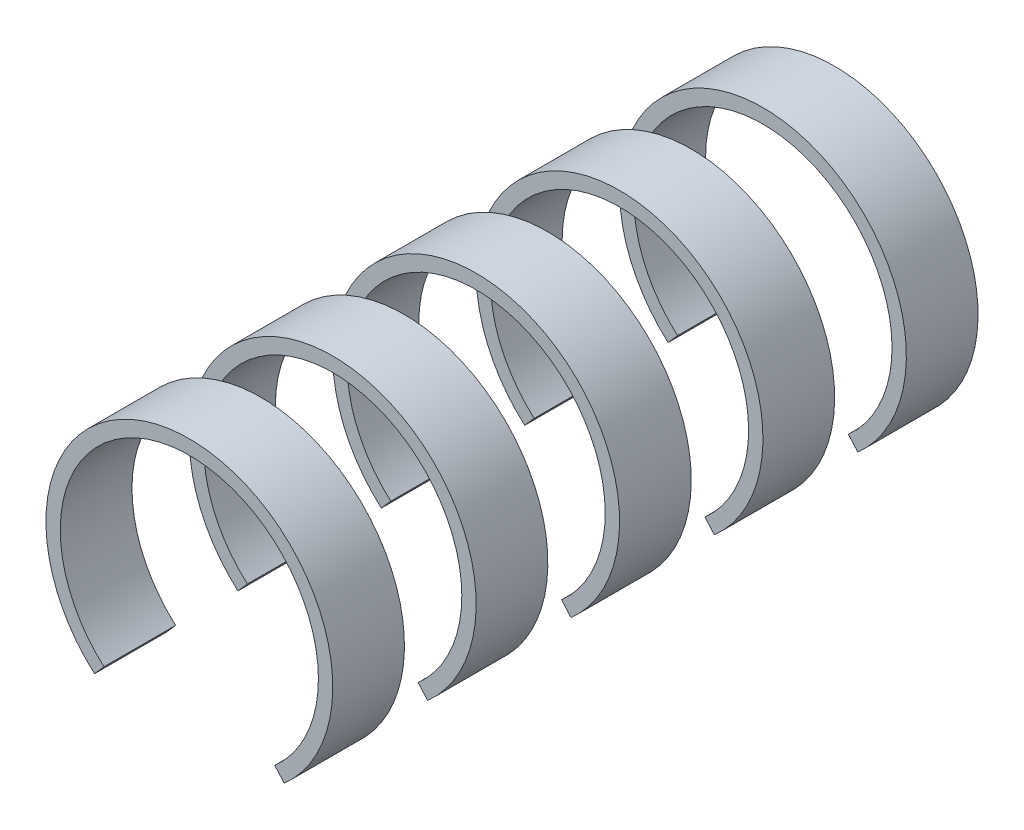
ISO-10303-21;
HEADER;
FILE_DESCRIPTION(('STEP AP214'),'2;1');
FILE_NAME('part.step','',(''),(''),'','','');
FILE_SCHEMA(('AUTOMOTIVE_DESIGN { 1 0 10303 214 1 1 1 1 }'));
ENDSEC;
DATA;
#1=APPLICATION_CONTEXT('core data for automotive mechanical design processes');
#2=APPLICATION_PROTOCOL_DEFINITION('international standard','automotive_design',2000,#1);
#3=PRODUCT_CONTEXT('',#1,'mechanical');
#4=PRODUCT('Part','Part','',(#3));
#5=PRODUCT_RELATED_PRODUCT_CATEGORY('part','',(#4));
#6=PRODUCT_DEFINITION_FORMATION('','',#4);
#7=PRODUCT_DEFINITION_CONTEXT('part definition',#1,'design');
#8=PRODUCT_DEFINITION('design','',#6,#7);
#9=PRODUCT_DEFINITION_SHAPE('','',#8);
#10=(LENGTH_UNIT() NAMED_UNIT(*) SI_UNIT(.MILLI.,.METRE.));
#11=(NAMED_UNIT(*) PLANE_ANGLE_UNIT() SI_UNIT($,.RADIAN.));
#12=(NAMED_UNIT(*) SI_UNIT($,.STERADIAN.) SOLID_ANGLE_UNIT());
#13=UNCERTAINTY_MEASURE_WITH_UNIT(LENGTH_MEASURE(1.E-05),#10,'distance_accuracy_value','');
#14=(GEOMETRIC_REPRESENTATION_CONTEXT(3) GLOBAL_UNCERTAINTY_ASSIGNED_CONTEXT((#13)) GLOBAL_UNIT_ASSIGNED_CONTEXT((#10,
#11,#12)) REPRESENTATION_CONTEXT('',''));
#15=CARTESIAN_POINT('',(0.,0.,0.));
#16=DIRECTION('',(0.,0.,1.));
#17=DIRECTION('',(1.,0.,0.));
#18=AXIS2_PLACEMENT_3D('',#15,#16,#17);
#19=CARTESIAN_POINT('',(0.,78.,-800.));
#20=DIRECTION('',(0.,0.,1.));
#21=DIRECTION('',(1.,0.,0.));
#22=AXIS2_PLACEMENT_3D('',#19,#20,#21);
#23=CYLINDRICAL_SURFACE('',#22,90.);
#24=CARTESIAN_POINT('',(0.,78.,-750.));
#25=DIRECTION('',(0.,0.,1.));
#26=DIRECTION('',(1.,0.,0.));
#27=AXIS2_PLACEMENT_3D('',#24,#25,#26);
#28=CIRCLE('',#27,90.);
#29=CARTESIAN_POINT('',(-59.5294044989533,10.5,-750.));
#30=VERTEX_POINT('',#29);
#31=CARTESIAN_POINT('',(59.5294044989532,10.5,-750.));
#32=VERTEX_POINT('',#31);
#33=EDGE_CURVE('E115',#30,#32,#28,.F.);
#34=ORIENTED_EDGE('',*,*,#33,.F.);
#35=DIRECTION('',(0.,0.,1.));
#36=VECTOR('',#35,1.);
#37=CARTESIAN_POINT('',(-59.5294044989533,10.5,-800.));
#38=LINE('',#37,#36);
#39=CARTESIAN_POINT('',(-59.5294044989533,10.5,-800.));
#40=VERTEX_POINT('',#39);
#41=EDGE_CURVE('E12',#40,#30,#38,.T.);
#42=ORIENTED_EDGE('',*,*,#41,.F.);
#43=CARTESIAN_POINT('',(0.,78.,-800.));
#44=DIRECTION('',(0.,0.,1.));
#45=DIRECTION('',(1.,0.,0.));
#46=AXIS2_PLACEMENT_3D('',#43,#44,#45);
#47=CIRCLE('',#46,90.);
#48=CARTESIAN_POINT('',(59.5294044989532,10.5,-800.));
#49=VERTEX_POINT('',#48);
#50=EDGE_CURVE('E110',#40,#49,#47,.F.);
#51=ORIENTED_EDGE('',*,*,#50,.T.);
#52=DIRECTION('',(0.,0.,1.));
#53=VECTOR('',#52,1.);
#54=CARTESIAN_POINT('',(59.5294044989532,10.5,-800.));
#55=LINE('',#54,#53);
#56=EDGE_CURVE('E53',#49,#32,#55,.T.);
#57=ORIENTED_EDGE('',*,*,#56,.T.);
#58=EDGE_LOOP('',(#34,#42,#51,#57));
#59=FACE_BOUND('',#58,.T.);
#60=ADVANCED_FACE('F50',(#59),#23,.F.);
#61=CARTESIAN_POINT('',(-59.5294044989533,10.5,-800.));
#62=DIRECTION('',(-0.750000000000002,0.661437827766145,0.));
#63=DIRECTION('',(-0.661437827766145,-0.750000000000002,0.));
#64=AXIS2_PLACEMENT_3D('',#61,#62,#63);
#65=PLANE('',#64);
#66=DIRECTION('',(-0.661437827766145,-0.750000000000002,0.));
#67=VECTOR('',#66,1.);
#68=CARTESIAN_POINT('',(-59.5294044989533,10.5,-750.));
#69=LINE('',#68,#67);
#70=CARTESIAN_POINT('',(-66.1437827766148,3.,-750.));
#71=VERTEX_POINT('',#70);
#72=EDGE_CURVE('E83',#30,#71,#69,.T.);
#73=ORIENTED_EDGE('',*,*,#72,.T.);
#74=DIRECTION('',(0.,0.,1.));
#75=VECTOR('',#74,1.);
#76=CARTESIAN_POINT('',(-66.1437827766148,3.,-800.));
#77=LINE('',#76,#75);
#78=CARTESIAN_POINT('',(-66.1437827766148,3.,-800.));
#79=VERTEX_POINT('',#78);
#80=EDGE_CURVE('E59',#79,#71,#77,.T.);
#81=ORIENTED_EDGE('',*,*,#80,.F.);
#82=DIRECTION('',(-0.661437827766145,-0.750000000000002,0.));
#83=VECTOR('',#82,1.);
#84=CARTESIAN_POINT('',(-59.5294044989533,10.5,-800.));
#85=LINE('',#84,#83);
#86=EDGE_CURVE('E98',#40,#79,#85,.T.);
#87=ORIENTED_EDGE('',*,*,#86,.F.);
#88=ORIENTED_EDGE('',*,*,#41,.T.);
#89=EDGE_LOOP('',(#73,#81,#87,#88));
#90=FACE_BOUND('',#89,.T.);
#91=ADVANCED_FACE('F125',(#90),#65,.F.);
#92=CARTESIAN_POINT('',(0.,78.,-800.));
#93=DIRECTION('',(0.,0.,1.));
#94=DIRECTION('',(1.,0.,0.));
#95=AXIS2_PLACEMENT_3D('',#92,#93,#94);
#96=CYLINDRICAL_SURFACE('',#95,100.);
#97=CARTESIAN_POINT('',(0.,78.,-750.));
#98=DIRECTION('',(0.,0.,-1.));
#99=DIRECTION('',(-1.,0.,0.));
#100=AXIS2_PLACEMENT_3D('',#97,#98,#99);
#101=CIRCLE('',#100,100.);
#102=CARTESIAN_POINT('',(66.1437827766147,2.99999999999998,-750.));
#103=VERTEX_POINT('',#102);
#104=EDGE_CURVE('E105',#71,#103,#101,.T.);
#105=ORIENTED_EDGE('',*,*,#104,.T.);
#106=DIRECTION('',(0.,0.,1.));
#107=VECTOR('',#106,1.);
#108=CARTESIAN_POINT('',(66.1437827766147,2.99999999999998,-800.));
#109=LINE('',#108,#107);
#110=CARTESIAN_POINT('',(66.1437827766147,2.99999999999998,-800.));
#111=VERTEX_POINT('',#110);
#112=EDGE_CURVE('E102',#111,#103,#109,.T.);
#113=ORIENTED_EDGE('',*,*,#112,.F.);
#114=CARTESIAN_POINT('',(0.,78.,-800.));
#115=DIRECTION('',(0.,0.,-1.));
#116=DIRECTION('',(-1.,0.,0.));
#117=AXIS2_PLACEMENT_3D('',#114,#115,#116);
#118=CIRCLE('',#117,100.);
#119=EDGE_CURVE('E95',#79,#111,#118,.T.);
#120=ORIENTED_EDGE('',*,*,#119,.F.);
#121=ORIENTED_EDGE('',*,*,#80,.T.);
#122=EDGE_LOOP('',(#105,#113,#120,#121));
#123=FACE_BOUND('',#122,.T.);
#124=ADVANCED_FACE('F103',(#123),#96,.T.);
#125=CARTESIAN_POINT('',(66.1437827766147,2.99999999999998,-800.));
#126=DIRECTION('',(0.749999999999998,0.66143782776615,0.));
#127=DIRECTION('',(-0.66143782776615,0.749999999999998,0.));
#128=AXIS2_PLACEMENT_3D('',#125,#126,#127);
#129=PLANE('',#128);
#130=DIRECTION('',(-0.66143782776615,0.749999999999998,0.));
#131=VECTOR('',#130,1.);
#132=CARTESIAN_POINT('',(66.1437827766147,2.99999999999998,-750.));
#133=LINE('',#132,#131);
#134=EDGE_CURVE('E118',#103,#32,#133,.T.);
#135=ORIENTED_EDGE('',*,*,#134,.T.);
#136=ORIENTED_EDGE('',*,*,#56,.F.);
#137=DIRECTION('',(-0.66143782776615,0.749999999999998,0.));
#138=VECTOR('',#137,1.);
#139=CARTESIAN_POINT('',(66.1437827766147,2.99999999999998,-800.));
#140=LINE('',#139,#138);
#141=EDGE_CURVE('E92',#111,#49,#140,.T.);
#142=ORIENTED_EDGE('',*,*,#141,.F.);
#143=ORIENTED_EDGE('',*,*,#112,.T.);
#144=EDGE_LOOP('',(#135,#136,#142,#143));
#145=FACE_BOUND('',#144,.T.);
#146=ADVANCED_FACE('F109',(#145),#129,.F.);
#147=CARTESIAN_POINT('',(0.,78.,-800.));
#148=DIRECTION('',(0.,0.,1.));
#149=DIRECTION('',(1.,0.,0.));
#150=AXIS2_PLACEMENT_3D('',#147,#148,#149);
#151=PLANE('',#150);
#152=ORIENTED_EDGE('',*,*,#50,.F.);
#153=ORIENTED_EDGE('',*,*,#86,.T.);
#154=ORIENTED_EDGE('',*,*,#119,.T.);
#155=ORIENTED_EDGE('',*,*,#141,.T.);
#156=EDGE_LOOP('',(#152,#153,#154,#155));
#157=FACE_BOUND('',#156,.T.);
#158=ADVANCED_FACE('F97',(#157),#151,.F.);
#159=CARTESIAN_POINT('',(0.,78.,-750.));
#160=DIRECTION('',(0.,0.,1.));
#161=DIRECTION('',(1.,0.,0.));
#162=AXIS2_PLACEMENT_3D('',#159,#160,#161);
#163=PLANE('',#162);
#164=ORIENTED_EDGE('',*,*,#33,.T.);
#165=ORIENTED_EDGE('',*,*,#134,.F.);
#166=ORIENTED_EDGE('',*,*,#104,.F.);
#167=ORIENTED_EDGE('',*,*,#72,.F.);
#168=EDGE_LOOP('',(#164,#165,#166,#167));
#169=FACE_BOUND('',#168,.T.);
#170=ADVANCED_FACE('F123',(#169),#163,.T.);
#171=CLOSED_SHELL('',(#60,#91,#124,#146,#158,#170));
#172=MANIFOLD_SOLID_BREP('B2',#171);
#173=CARTESIAN_POINT('',(0.,78.,-700.));
#174=DIRECTION('',(0.,0.,1.));
#175=DIRECTION('',(1.,0.,0.));
#176=AXIS2_PLACEMENT_3D('',#173,#174,#175);
#177=CYLINDRICAL_SURFACE('',#176,90.);
#178=CARTESIAN_POINT('',(0.,78.,-650.));
#179=DIRECTION('',(0.,0.,1.));
#180=DIRECTION('',(1.,0.,0.));
#181=AXIS2_PLACEMENT_3D('',#178,#179,#180);
#182=CIRCLE('',#181,90.);
#183=CARTESIAN_POINT('',(-59.5294044989533,10.5,-650.));
#184=VERTEX_POINT('',#183);
#185=CARTESIAN_POINT('',(59.5294044989532,10.5,-650.));
#186=VERTEX_POINT('',#185);
#187=EDGE_CURVE('E249',#184,#186,#182,.F.);
#188=ORIENTED_EDGE('',*,*,#187,.F.);
#189=DIRECTION('',(0.,0.,1.));
#190=VECTOR('',#189,1.);
#191=CARTESIAN_POINT('',(-59.5294044989533,10.5,-700.));
#192=LINE('',#191,#190);
#193=CARTESIAN_POINT('',(-59.5294044989533,10.5,-700.));
#194=VERTEX_POINT('',#193);
#195=EDGE_CURVE('E48',#194,#184,#192,.T.);
#196=ORIENTED_EDGE('',*,*,#195,.F.);
#197=CARTESIAN_POINT('',(0.,78.,-700.));
#198=DIRECTION('',(0.,0.,1.));
#199=DIRECTION('',(1.,0.,0.));
#200=AXIS2_PLACEMENT_3D('',#197,#198,#199);
#201=CIRCLE('',#200,90.);
#202=CARTESIAN_POINT('',(59.5294044989532,10.5,-700.));
#203=VERTEX_POINT('',#202);
#204=EDGE_CURVE('E244',#194,#203,#201,.F.);
#205=ORIENTED_EDGE('',*,*,#204,.T.);
#206=DIRECTION('',(0.,0.,1.));
#207=VECTOR('',#206,1.);
#208=CARTESIAN_POINT('',(59.5294044989532,10.5,-700.));
#209=LINE('',#208,#207);
#210=EDGE_CURVE('E187',#203,#186,#209,.T.);
#211=ORIENTED_EDGE('',*,*,#210,.T.);
#212=EDGE_LOOP('',(#188,#196,#205,#211));
#213=FACE_BOUND('',#212,.T.);
#214=ADVANCED_FACE('F184',(#213),#177,.F.);
#215=CARTESIAN_POINT('',(-59.5294044989533,10.5,-700.));
#216=DIRECTION('',(-0.750000000000002,0.661437827766145,0.));
#217=DIRECTION('',(-0.661437827766145,-0.750000000000002,0.));
#218=AXIS2_PLACEMENT_3D('',#215,#216,#217);
#219=PLANE('',#218);
#220=DIRECTION('',(-0.661437827766145,-0.750000000000002,0.));
#221=VECTOR('',#220,1.);
#222=CARTESIAN_POINT('',(-59.5294044989533,10.5,-650.));
#223=LINE('',#222,#221);
#224=CARTESIAN_POINT('',(-66.1437827766148,3.,-650.));
#225=VERTEX_POINT('',#224);
#226=EDGE_CURVE('E217',#184,#225,#223,.T.);
#227=ORIENTED_EDGE('',*,*,#226,.T.);
#228=DIRECTION('',(0.,0.,1.));
#229=VECTOR('',#228,1.);
#230=CARTESIAN_POINT('',(-66.1437827766148,3.,-700.));
#231=LINE('',#230,#229);
#232=CARTESIAN_POINT('',(-66.1437827766148,3.,-700.));
#233=VERTEX_POINT('',#232);
#234=EDGE_CURVE('E193',#233,#225,#231,.T.);
#235=ORIENTED_EDGE('',*,*,#234,.F.);
#236=DIRECTION('',(-0.661437827766145,-0.750000000000002,0.));
#237=VECTOR('',#236,1.);
#238=CARTESIAN_POINT('',(-59.5294044989533,10.5,-700.));
#239=LINE('',#238,#237);
#240=EDGE_CURVE('E232',#194,#233,#239,.T.);
#241=ORIENTED_EDGE('',*,*,#240,.F.);
#242=ORIENTED_EDGE('',*,*,#195,.T.);
#243=EDGE_LOOP('',(#227,#235,#241,#242));
#244=FACE_BOUND('',#243,.T.);
#245=ADVANCED_FACE('F259',(#244),#219,.F.);
#246=CARTESIAN_POINT('',(0.,78.,-700.));
#247=DIRECTION('',(0.,0.,1.));
#248=DIRECTION('',(1.,0.,0.));
#249=AXIS2_PLACEMENT_3D('',#246,#247,#248);
#250=CYLINDRICAL_SURFACE('',#249,100.);
#251=CARTESIAN_POINT('',(0.,78.,-650.));
#252=DIRECTION('',(0.,0.,-1.));
#253=DIRECTION('',(-1.,0.,0.));
#254=AXIS2_PLACEMENT_3D('',#251,#252,#253);
#255=CIRCLE('',#254,100.);
#256=CARTESIAN_POINT('',(66.1437827766147,2.99999999999998,-650.));
#257=VERTEX_POINT('',#256);
#258=EDGE_CURVE('E239',#225,#257,#255,.T.);
#259=ORIENTED_EDGE('',*,*,#258,.T.);
#260=DIRECTION('',(0.,0.,1.));
#261=VECTOR('',#260,1.);
#262=CARTESIAN_POINT('',(66.1437827766147,2.99999999999998,-700.));
#263=LINE('',#262,#261);
#264=CARTESIAN_POINT('',(66.1437827766147,2.99999999999998,-700.));
#265=VERTEX_POINT('',#264);
#266=EDGE_CURVE('E236',#265,#257,#263,.T.);
#267=ORIENTED_EDGE('',*,*,#266,.F.);
#268=CARTESIAN_POINT('',(0.,78.,-700.));
#269=DIRECTION('',(0.,0.,-1.));
#270=DIRECTION('',(-1.,0.,0.));
#271=AXIS2_PLACEMENT_3D('',#268,#269,#270);
#272=CIRCLE('',#271,100.);
#273=EDGE_CURVE('E229',#233,#265,#272,.T.);
#274=ORIENTED_EDGE('',*,*,#273,.F.);
#275=ORIENTED_EDGE('',*,*,#234,.T.);
#276=EDGE_LOOP('',(#259,#267,#274,#275));
#277=FACE_BOUND('',#276,.T.);
#278=ADVANCED_FACE('F237',(#277),#250,.T.);
#279=CARTESIAN_POINT('',(66.1437827766147,2.99999999999998,-700.));
#280=DIRECTION('',(0.749999999999998,0.66143782776615,0.));
#281=DIRECTION('',(-0.66143782776615,0.749999999999998,0.));
#282=AXIS2_PLACEMENT_3D('',#279,#280,#281);
#283=PLANE('',#282);
#284=DIRECTION('',(-0.66143782776615,0.749999999999998,0.));
#285=VECTOR('',#284,1.);
#286=CARTESIAN_POINT('',(66.1437827766147,2.99999999999998,-650.));
#287=LINE('',#286,#285);
#288=EDGE_CURVE('E252',#257,#186,#287,.T.);
#289=ORIENTED_EDGE('',*,*,#288,.T.);
#290=ORIENTED_EDGE('',*,*,#210,.F.);
#291=DIRECTION('',(-0.66143782776615,0.749999999999998,0.));
#292=VECTOR('',#291,1.);
#293=CARTESIAN_POINT('',(66.1437827766147,2.99999999999998,-700.));
#294=LINE('',#293,#292);
#295=EDGE_CURVE('E226',#265,#203,#294,.T.);
#296=ORIENTED_EDGE('',*,*,#295,.F.);
#297=ORIENTED_EDGE('',*,*,#266,.T.);
#298=EDGE_LOOP('',(#289,#290,#296,#297));
#299=FACE_BOUND('',#298,.T.);
#300=ADVANCED_FACE('F243',(#299),#283,.F.);
#301=CARTESIAN_POINT('',(0.,78.,-700.));
#302=DIRECTION('',(0.,0.,1.));
#303=DIRECTION('',(1.,0.,0.));
#304=AXIS2_PLACEMENT_3D('',#301,#302,#303);
#305=PLANE('',#304);
#306=ORIENTED_EDGE('',*,*,#204,.F.);
#307=ORIENTED_EDGE('',*,*,#240,.T.);
#308=ORIENTED_EDGE('',*,*,#273,.T.);
#309=ORIENTED_EDGE('',*,*,#295,.T.);
#310=EDGE_LOOP('',(#306,#307,#308,#309));
#311=FACE_BOUND('',#310,.T.);
#312=ADVANCED_FACE('F231',(#311),#305,.F.);
#313=CARTESIAN_POINT('',(0.,78.,-650.));
#314=DIRECTION('',(0.,0.,1.));
#315=DIRECTION('',(1.,0.,0.));
#316=AXIS2_PLACEMENT_3D('',#313,#314,#315);
#317=PLANE('',#316);
#318=ORIENTED_EDGE('',*,*,#187,.T.);
#319=ORIENTED_EDGE('',*,*,#288,.F.);
#320=ORIENTED_EDGE('',*,*,#258,.F.);
#321=ORIENTED_EDGE('',*,*,#226,.F.);
#322=EDGE_LOOP('',(#318,#319,#320,#321));
#323=FACE_BOUND('',#322,.T.);
#324=ADVANCED_FACE('F257',(#323),#317,.T.);
#325=CLOSED_SHELL('',(#214,#245,#278,#300,#312,#324));
#326=MANIFOLD_SOLID_BREP('B6',#325);
#327=CARTESIAN_POINT('',(0.,78.,-600.));
#328=DIRECTION('',(0.,0.,1.));
#329=DIRECTION('',(1.,0.,0.));
#330=AXIS2_PLACEMENT_3D('',#327,#328,#329);
#331=CYLINDRICAL_SURFACE('',#330,90.);
#332=CARTESIAN_POINT('',(0.,78.,-550.));
#333=DIRECTION('',(0.,0.,1.));
#334=DIRECTION('',(1.,0.,0.));
#335=AXIS2_PLACEMENT_3D('',#332,#333,#334);
#336=CIRCLE('',#335,90.);
#337=CARTESIAN_POINT('',(-59.5294044989533,10.5,-550.));
#338=VERTEX_POINT('',#337);
#339=CARTESIAN_POINT('',(59.5294044989532,10.5,-550.));
#340=VERTEX_POINT('',#339);
#341=EDGE_CURVE('E383',#338,#340,#336,.F.);
#342=ORIENTED_EDGE('',*,*,#341,.F.);
#343=DIRECTION('',(0.,0.,1.));
#344=VECTOR('',#343,1.);
#345=CARTESIAN_POINT('',(-59.5294044989533,10.5,-600.));
#346=LINE('',#345,#344);
#347=CARTESIAN_POINT('',(-59.5294044989533,10.5,-600.));
#348=VERTEX_POINT('',#347);
#349=EDGE_CURVE('E182',#348,#338,#346,.T.);
#350=ORIENTED_EDGE('',*,*,#349,.F.);
#351=CARTESIAN_POINT('',(0.,78.,-600.));
#352=DIRECTION('',(0.,0.,1.));
#353=DIRECTION('',(1.,0.,0.));
#354=AXIS2_PLACEMENT_3D('',#351,#352,#353);
#355=CIRCLE('',#354,90.);
#356=CARTESIAN_POINT('',(59.5294044989532,10.5,-600.));
#357=VERTEX_POINT('',#356);
#358=EDGE_CURVE('E378',#348,#357,#355,.F.);
#359=ORIENTED_EDGE('',*,*,#358,.T.);
#360=DIRECTION('',(0.,0.,1.));
#361=VECTOR('',#360,1.);
#362=CARTESIAN_POINT('',(59.5294044989532,10.5,-600.));
#363=LINE('',#362,#361);
#364=EDGE_CURVE('E321',#357,#340,#363,.T.);
#365=ORIENTED_EDGE('',*,*,#364,.T.);
#366=EDGE_LOOP('',(#342,#350,#359,#365));
#367=FACE_BOUND('',#366,.T.);
#368=ADVANCED_FACE('F318',(#367),#331,.F.);
#369=CARTESIAN_POINT('',(-59.5294044989533,10.5,-600.));
#370=DIRECTION('',(-0.750000000000002,0.661437827766145,0.));
#371=DIRECTION('',(-0.661437827766145,-0.750000000000002,0.));
#372=AXIS2_PLACEMENT_3D('',#369,#370,#371);
#373=PLANE('',#372);
#374=DIRECTION('',(-0.661437827766145,-0.750000000000002,0.));
#375=VECTOR('',#374,1.);
#376=CARTESIAN_POINT('',(-59.5294044989533,10.5,-550.));
#377=LINE('',#376,#375);
#378=CARTESIAN_POINT('',(-66.1437827766148,3.,-550.));
#379=VERTEX_POINT('',#378);
#380=EDGE_CURVE('E351',#338,#379,#377,.T.);
#381=ORIENTED_EDGE('',*,*,#380,.T.);
#382=DIRECTION('',(0.,0.,1.));
#383=VECTOR('',#382,1.);
#384=CARTESIAN_POINT('',(-66.1437827766148,3.,-600.));
#385=LINE('',#384,#383);
#386=CARTESIAN_POINT('',(-66.1437827766148,3.,-600.));
#387=VERTEX_POINT('',#386);
#388=EDGE_CURVE('E327',#387,#379,#385,.T.);
#389=ORIENTED_EDGE('',*,*,#388,.F.);
#390=DIRECTION('',(-0.661437827766145,-0.750000000000002,0.));
#391=VECTOR('',#390,1.);
#392=CARTESIAN_POINT('',(-59.5294044989533,10.5,-600.));
#393=LINE('',#392,#391);
#394=EDGE_CURVE('E366',#348,#387,#393,.T.);
#395=ORIENTED_EDGE('',*,*,#394,.F.);
#396=ORIENTED_EDGE('',*,*,#349,.T.);
#397=EDGE_LOOP('',(#381,#389,#395,#396));
#398=FACE_BOUND('',#397,.T.);
#399=ADVANCED_FACE('F393',(#398),#373,.F.);
#400=CARTESIAN_POINT('',(0.,78.,-600.));
#401=DIRECTION('',(0.,0.,1.));
#402=DIRECTION('',(1.,0.,0.));
#403=AXIS2_PLACEMENT_3D('',#400,#401,#402);
#404=CYLINDRICAL_SURFACE('',#403,100.);
#405=CARTESIAN_POINT('',(0.,78.,-550.));
#406=DIRECTION('',(0.,0.,-1.));
#407=DIRECTION('',(-1.,0.,0.));
#408=AXIS2_PLACEMENT_3D('',#405,#406,#407);
#409=CIRCLE('',#408,100.);
#410=CARTESIAN_POINT('',(66.1437827766147,2.99999999999998,-550.));
#411=VERTEX_POINT('',#410);
#412=EDGE_CURVE('E373',#379,#411,#409,.T.);
#413=ORIENTED_EDGE('',*,*,#412,.T.);
#414=DIRECTION('',(0.,0.,1.));
#415=VECTOR('',#414,1.);
#416=CARTESIAN_POINT('',(66.1437827766147,2.99999999999998,-600.));
#417=LINE('',#416,#415);
#418=CARTESIAN_POINT('',(66.1437827766147,2.99999999999998,-600.));
#419=VERTEX_POINT('',#418);
#420=EDGE_CURVE('E370',#419,#411,#417,.T.);
#421=ORIENTED_EDGE('',*,*,#420,.F.);
#422=CARTESIAN_POINT('',(0.,78.,-600.));
#423=DIRECTION('',(0.,0.,-1.));
#424=DIRECTION('',(-1.,0.,0.));
#425=AXIS2_PLACEMENT_3D('',#422,#423,#424);
#426=CIRCLE('',#425,100.);
#427=EDGE_CURVE('E363',#387,#419,#426,.T.);
#428=ORIENTED_EDGE('',*,*,#427,.F.);
#429=ORIENTED_EDGE('',*,*,#388,.T.);
#430=EDGE_LOOP('',(#413,#421,#428,#429));
#431=FACE_BOUND('',#430,.T.);
#432=ADVANCED_FACE('F371',(#431),#404,.T.);
#433=CARTESIAN_POINT('',(66.1437827766147,2.99999999999998,-600.));
#434=DIRECTION('',(0.749999999999998,0.66143782776615,0.));
#435=DIRECTION('',(-0.66143782776615,0.749999999999998,0.));
#436=AXIS2_PLACEMENT_3D('',#433,#434,#435);
#437=PLANE('',#436);
#438=DIRECTION('',(-0.66143782776615,0.749999999999998,0.));
#439=VECTOR('',#438,1.);
#440=CARTESIAN_POINT('',(66.1437827766147,2.99999999999998,-550.));
#441=LINE('',#440,#439);
#442=EDGE_CURVE('E386',#411,#340,#441,.T.);
#443=ORIENTED_EDGE('',*,*,#442,.T.);
#444=ORIENTED_EDGE('',*,*,#364,.F.);
#445=DIRECTION('',(-0.66143782776615,0.749999999999998,0.));
#446=VECTOR('',#445,1.);
#447=CARTESIAN_POINT('',(66.1437827766147,2.99999999999998,-600.));
#448=LINE('',#447,#446);
#449=EDGE_CURVE('E360',#419,#357,#448,.T.);
#450=ORIENTED_EDGE('',*,*,#449,.F.);
#451=ORIENTED_EDGE('',*,*,#420,.T.);
#452=EDGE_LOOP('',(#443,#444,#450,#451));
#453=FACE_BOUND('',#452,.T.);
#454=ADVANCED_FACE('F377',(#453),#437,.F.);
#455=CARTESIAN_POINT('',(0.,78.,-600.));
#456=DIRECTION('',(0.,0.,1.));
#457=DIRECTION('',(1.,0.,0.));
#458=AXIS2_PLACEMENT_3D('',#455,#456,#457);
#459=PLANE('',#458);
#460=ORIENTED_EDGE('',*,*,#358,.F.);
#461=ORIENTED_EDGE('',*,*,#394,.T.);
#462=ORIENTED_EDGE('',*,*,#427,.T.);
#463=ORIENTED_EDGE('',*,*,#449,.T.);
#464=EDGE_LOOP('',(#460,#461,#462,#463));
#465=FACE_BOUND('',#464,.T.);
#466=ADVANCED_FACE('F365',(#465),#459,.F.);
#467=CARTESIAN_POINT('',(0.,78.,-550.));
#468=DIRECTION('',(0.,0.,1.));
#469=DIRECTION('',(1.,0.,0.));
#470=AXIS2_PLACEMENT_3D('',#467,#468,#469);
#471=PLANE('',#470);
#472=ORIENTED_EDGE('',*,*,#341,.T.);
#473=ORIENTED_EDGE('',*,*,#442,.F.);
#474=ORIENTED_EDGE('',*,*,#412,.F.);
#475=ORIENTED_EDGE('',*,*,#380,.F.);
#476=EDGE_LOOP('',(#472,#473,#474,#475));
#477=FACE_BOUND('',#476,.T.);
#478=ADVANCED_FACE('F391',(#477),#471,.T.);
#479=CLOSED_SHELL('',(#368,#399,#432,#454,#466,#478));
#480=MANIFOLD_SOLID_BREP('B42',#479);
#481=CARTESIAN_POINT('',(0.,78.,-500.));
#482=DIRECTION('',(0.,0.,1.));
#483=DIRECTION('',(1.,0.,0.));
#484=AXIS2_PLACEMENT_3D('',#481,#482,#483);
#485=CYLINDRICAL_SURFACE('',#484,90.);
#486=CARTESIAN_POINT('',(0.,78.,-450.));
#487=DIRECTION('',(0.,0.,1.));
#488=DIRECTION('',(1.,0.,0.));
#489=AXIS2_PLACEMENT_3D('',#486,#487,#488);
#490=CIRCLE('',#489,90.);
#491=CARTESIAN_POINT('',(-59.5294044989533,10.5,-450.));
#492=VERTEX_POINT('',#491);
#493=CARTESIAN_POINT('',(59.5294044989532,10.5,-450.));
#494=VERTEX_POINT('',#493);
#495=EDGE_CURVE('E516',#492,#494,#490,.F.);
#496=ORIENTED_EDGE('',*,*,#495,.F.);
#497=DIRECTION('',(0.,0.,1.));
#498=VECTOR('',#497,1.);
#499=CARTESIAN_POINT('',(-59.5294044989533,10.5,-500.));
#500=LINE('',#499,#498);
#501=CARTESIAN_POINT('',(-59.5294044989533,10.5,-500.));
#502=VERTEX_POINT('',#501);
#503=EDGE_CURVE('E316',#502,#492,#500,.T.);
#504=ORIENTED_EDGE('',*,*,#503,.F.);
#505=CARTESIAN_POINT('',(0.,78.,-500.));
#506=DIRECTION('',(0.,0.,1.));
#507=DIRECTION('',(1.,0.,0.));
#508=AXIS2_PLACEMENT_3D('',#505,#506,#507);
#509=CIRCLE('',#508,90.);
#510=CARTESIAN_POINT('',(59.5294044989532,10.5,-500.));
#511=VERTEX_POINT('',#510);
#512=EDGE_CURVE('E511',#502,#511,#509,.F.);
#513=ORIENTED_EDGE('',*,*,#512,.T.);
#514=DIRECTION('',(0.,0.,1.));
#515=VECTOR('',#514,1.);
#516=CARTESIAN_POINT('',(59.5294044989532,10.5,-500.));
#517=LINE('',#516,#515);
#518=EDGE_CURVE('E454',#511,#494,#517,.T.);
#519=ORIENTED_EDGE('',*,*,#518,.T.);
#520=EDGE_LOOP('',(#496,#504,#513,#519));
#521=FACE_BOUND('',#520,.T.);
#522=ADVANCED_FACE('F451',(#521),#485,.F.);
#523=CARTESIAN_POINT('',(-59.5294044989533,10.5,-500.));
#524=DIRECTION('',(-0.750000000000002,0.661437827766145,0.));
#525=DIRECTION('',(-0.661437827766145,-0.750000000000002,0.));
#526=AXIS2_PLACEMENT_3D('',#523,#524,#525);
#527=PLANE('',#526);
#528=DIRECTION('',(-0.661437827766145,-0.750000000000002,0.));
#529=VECTOR('',#528,1.);
#530=CARTESIAN_POINT('',(-59.5294044989533,10.5,-450.));
#531=LINE('',#530,#529);
#532=CARTESIAN_POINT('',(-66.1437827766148,3.,-450.));
#533=VERTEX_POINT('',#532);
#534=EDGE_CURVE('E484',#492,#533,#531,.T.);
#535=ORIENTED_EDGE('',*,*,#534,.T.);
#536=DIRECTION('',(0.,0.,1.));
#537=VECTOR('',#536,1.);
#538=CARTESIAN_POINT('',(-66.1437827766148,3.,-500.));
#539=LINE('',#538,#537);
#540=CARTESIAN_POINT('',(-66.1437827766148,3.,-500.));
#541=VERTEX_POINT('',#540);
#542=EDGE_CURVE('E460',#541,#533,#539,.T.);
#543=ORIENTED_EDGE('',*,*,#542,.F.);
#544=DIRECTION('',(-0.661437827766145,-0.750000000000002,0.));
#545=VECTOR('',#544,1.);
#546=CARTESIAN_POINT('',(-59.5294044989533,10.5,-500.));
#547=LINE('',#546,#545);
#548=EDGE_CURVE('E499',#502,#541,#547,.T.);
#549=ORIENTED_EDGE('',*,*,#548,.F.);
#550=ORIENTED_EDGE('',*,*,#503,.T.);
#551=EDGE_LOOP('',(#535,#543,#549,#550));
#552=FACE_BOUND('',#551,.T.);
#553=ADVANCED_FACE('F526',(#552),#527,.F.);
#554=CARTESIAN_POINT('',(0.,78.,-500.));
#555=DIRECTION('',(0.,0.,1.));
#556=DIRECTION('',(1.,0.,0.));
#557=AXIS2_PLACEMENT_3D('',#554,#555,#556);
#558=CYLINDRICAL_SURFACE('',#557,100.);
#559=CARTESIAN_POINT('',(0.,78.,-450.));
#560=DIRECTION('',(0.,0.,-1.));
#561=DIRECTION('',(-1.,0.,0.));
#562=AXIS2_PLACEMENT_3D('',#559,#560,#561);
#563=CIRCLE('',#562,100.);
#564=CARTESIAN_POINT('',(66.1437827766147,2.99999999999998,-450.));
#565=VERTEX_POINT('',#564);
#566=EDGE_CURVE('E506',#533,#565,#563,.T.);
#567=ORIENTED_EDGE('',*,*,#566,.T.);
#568=DIRECTION('',(0.,0.,1.));
#569=VECTOR('',#568,1.);
#570=CARTESIAN_POINT('',(66.1437827766147,2.99999999999998,-500.));
#571=LINE('',#570,#569);
#572=CARTESIAN_POINT('',(66.1437827766147,2.99999999999998,-500.));
#573=VERTEX_POINT('',#572);
#574=EDGE_CURVE('E503',#573,#565,#571,.T.);
#575=ORIENTED_EDGE('',*,*,#574,.F.);
#576=CARTESIAN_POINT('',(0.,78.,-500.));
#577=DIRECTION('',(0.,0.,-1.));
#578=DIRECTION('',(-1.,0.,0.));
#579=AXIS2_PLACEMENT_3D('',#576,#577,#578);
#580=CIRCLE('',#579,100.);
#581=EDGE_CURVE('E496',#541,#573,#580,.T.);
#582=ORIENTED_EDGE('',*,*,#581,.F.);
#583=ORIENTED_EDGE('',*,*,#542,.T.);
#584=EDGE_LOOP('',(#567,#575,#582,#583));
#585=FACE_BOUND('',#584,.T.);
#586=ADVANCED_FACE('F504',(#585),#558,.T.);
#587=CARTESIAN_POINT('',(66.1437827766147,2.99999999999998,-500.));
#588=DIRECTION('',(0.749999999999998,0.66143782776615,0.));
#589=DIRECTION('',(-0.66143782776615,0.749999999999998,0.));
#590=AXIS2_PLACEMENT_3D('',#587,#588,#589);
#591=PLANE('',#590);
#592=DIRECTION('',(-0.66143782776615,0.749999999999998,0.));
#593=VECTOR('',#592,1.);
#594=CARTESIAN_POINT('',(66.1437827766147,2.99999999999998,-450.));
#595=LINE('',#594,#593);
#596=EDGE_CURVE('E519',#565,#494,#595,.T.);
#597=ORIENTED_EDGE('',*,*,#596,.T.);
#598=ORIENTED_EDGE('',*,*,#518,.F.);
#599=DIRECTION('',(-0.66143782776615,0.749999999999998,0.));
#600=VECTOR('',#599,1.);
#601=CARTESIAN_POINT('',(66.1437827766147,2.99999999999998,-500.));
#602=LINE('',#601,#600);
#603=EDGE_CURVE('E493',#573,#511,#602,.T.);
#604=ORIENTED_EDGE('',*,*,#603,.F.);
#605=ORIENTED_EDGE('',*,*,#574,.T.);
#606=EDGE_LOOP('',(#597,#598,#604,#605));
#607=FACE_BOUND('',#606,.T.);
#608=ADVANCED_FACE('F510',(#607),#591,.F.);
#609=CARTESIAN_POINT('',(0.,78.,-500.));
#610=DIRECTION('',(0.,0.,1.));
#611=DIRECTION('',(1.,0.,0.));
#612=AXIS2_PLACEMENT_3D('',#609,#610,#611);
#613=PLANE('',#612);
#614=ORIENTED_EDGE('',*,*,#512,.F.);
#615=ORIENTED_EDGE('',*,*,#548,.T.);
#616=ORIENTED_EDGE('',*,*,#581,.T.);
#617=ORIENTED_EDGE('',*,*,#603,.T.);
#618=EDGE_LOOP('',(#614,#615,#616,#617));
#619=FACE_BOUND('',#618,.T.);
#620=ADVANCED_FACE('F498',(#619),#613,.F.);
#621=CARTESIAN_POINT('',(0.,78.,-450.));
#622=DIRECTION('',(0.,0.,1.));
#623=DIRECTION('',(1.,0.,0.));
#624=AXIS2_PLACEMENT_3D('',#621,#622,#623);
#625=PLANE('',#624);
#626=ORIENTED_EDGE('',*,*,#495,.T.);
#627=ORIENTED_EDGE('',*,*,#596,.F.);
#628=ORIENTED_EDGE('',*,*,#566,.F.);
#629=ORIENTED_EDGE('',*,*,#534,.F.);
#630=EDGE_LOOP('',(#626,#627,#628,#629));
#631=FACE_BOUND('',#630,.T.);
#632=ADVANCED_FACE('F524',(#631),#625,.T.);
#633=CLOSED_SHELL('',(#522,#553,#586,#608,#620,#632));
#634=MANIFOLD_SOLID_BREP('B176',#633);
#635=CARTESIAN_POINT('',(0.,78.,-400.));
#636=DIRECTION('',(0.,0.,1.));
#637=DIRECTION('',(1.,0.,0.));
#638=AXIS2_PLACEMENT_3D('',#635,#636,#637);
#639=CYLINDRICAL_SURFACE('',#638,90.);
#640=CARTESIAN_POINT('',(0.,78.,-350.));
#641=DIRECTION('',(0.,0.,1.));
#642=DIRECTION('',(1.,0.,0.));
#643=AXIS2_PLACEMENT_3D('',#640,#641,#642);
#644=CIRCLE('',#643,90.);
#645=CARTESIAN_POINT('',(-59.5294044989533,10.5,-350.));
#646=VERTEX_POINT('',#645);
#647=CARTESIAN_POINT('',(59.5294044989532,10.5,-350.));
#648=VERTEX_POINT('',#647);
#649=EDGE_CURVE('E640',#646,#648,#644,.F.);
#650=ORIENTED_EDGE('',*,*,#649,.F.);
#651=DIRECTION('',(0.,0.,1.));
#652=VECTOR('',#651,1.);
#653=CARTESIAN_POINT('',(-59.5294044989533,10.5,-400.));
#654=LINE('',#653,#652);
#655=CARTESIAN_POINT('',(-59.5294044989533,10.5,-400.));
#656=VERTEX_POINT('',#655);
#657=EDGE_CURVE('E449',#656,#646,#654,.T.);
#658=ORIENTED_EDGE('',*,*,#657,.F.);
#659=CARTESIAN_POINT('',(0.,78.,-400.));
#660=DIRECTION('',(0.,0.,1.));
#661=DIRECTION('',(1.,0.,0.));
#662=AXIS2_PLACEMENT_3D('',#659,#660,#661);
#663=CIRCLE('',#662,90.);
#664=CARTESIAN_POINT('',(59.5294044989532,10.5,-400.));
#665=VERTEX_POINT('',#664);
#666=EDGE_CURVE('E635',#656,#665,#663,.F.);
#667=ORIENTED_EDGE('',*,*,#666,.T.);
#668=DIRECTION('',(0.,0.,1.));
#669=VECTOR('',#668,1.);
#670=CARTESIAN_POINT('',(59.5294044989532,10.5,-400.));
#671=LINE('',#670,#669);
#672=EDGE_CURVE('E578',#665,#648,#671,.T.);
#673=ORIENTED_EDGE('',*,*,#672,.T.);
#674=EDGE_LOOP('',(#650,#658,#667,#673));
#675=FACE_BOUND('',#674,.T.);
#676=ADVANCED_FACE('F575',(#675),#639,.F.);
#677=CARTESIAN_POINT('',(-59.5294044989533,10.5,-400.));
#678=DIRECTION('',(-0.750000000000002,0.661437827766145,0.));
#679=DIRECTION('',(-0.661437827766145,-0.750000000000002,0.));
#680=AXIS2_PLACEMENT_3D('',#677,#678,#679);
#681=PLANE('',#680);
#682=DIRECTION('',(-0.661437827766145,-0.750000000000002,0.));
#683=VECTOR('',#682,1.);
#684=CARTESIAN_POINT('',(-59.5294044989533,10.5,-350.));
#685=LINE('',#684,#683);
#686=CARTESIAN_POINT('',(-66.1437827766148,3.,-350.));
#687=VERTEX_POINT('',#686);
#688=EDGE_CURVE('E608',#646,#687,#685,.T.);
#689=ORIENTED_EDGE('',*,*,#688,.T.);
#690=DIRECTION('',(0.,0.,1.));
#691=VECTOR('',#690,1.);
#692=CARTESIAN_POINT('',(-66.1437827766148,3.,-400.));
#693=LINE('',#692,#691);
#694=CARTESIAN_POINT('',(-66.1437827766148,3.,-400.));
#695=VERTEX_POINT('',#694);
#696=EDGE_CURVE('E584',#695,#687,#693,.T.);
#697=ORIENTED_EDGE('',*,*,#696,.F.);
#698=DIRECTION('',(-0.661437827766145,-0.750000000000002,0.));
#699=VECTOR('',#698,1.);
#700=CARTESIAN_POINT('',(-59.5294044989533,10.5,-400.));
#701=LINE('',#700,#699);
#702=EDGE_CURVE('E623',#656,#695,#701,.T.);
#703=ORIENTED_EDGE('',*,*,#702,.F.);
#704=ORIENTED_EDGE('',*,*,#657,.T.);
#705=EDGE_LOOP('',(#689,#697,#703,#704));
#706=FACE_BOUND('',#705,.T.);
#707=ADVANCED_FACE('F650',(#706),#681,.F.);
#708=CARTESIAN_POINT('',(0.,78.,-400.));
#709=DIRECTION('',(0.,0.,1.));
#710=DIRECTION('',(1.,0.,0.));
#711=AXIS2_PLACEMENT_3D('',#708,#709,#710);
#712=CYLINDRICAL_SURFACE('',#711,100.);
#713=CARTESIAN_POINT('',(0.,78.,-350.));
#714=DIRECTION('',(0.,0.,-1.));
#715=DIRECTION('',(-1.,0.,0.));
#716=AXIS2_PLACEMENT_3D('',#713,#714,#715);
#717=CIRCLE('',#716,100.);
#718=CARTESIAN_POINT('',(66.1437827766147,2.99999999999998,-350.));
#719=VERTEX_POINT('',#718);
#720=EDGE_CURVE('E630',#687,#719,#717,.T.);
#721=ORIENTED_EDGE('',*,*,#720,.T.);
#722=DIRECTION('',(0.,0.,1.));
#723=VECTOR('',#722,1.);
#724=CARTESIAN_POINT('',(66.1437827766147,2.99999999999998,-400.));
#725=LINE('',#724,#723);
#726=CARTESIAN_POINT('',(66.1437827766147,2.99999999999998,-400.));
#727=VERTEX_POINT('',#726);
#728=EDGE_CURVE('E627',#727,#719,#725,.T.);
#729=ORIENTED_EDGE('',*,*,#728,.F.);
#730=CARTESIAN_POINT('',(0.,78.,-400.));
#731=DIRECTION('',(0.,0.,-1.));
#732=DIRECTION('',(-1.,0.,0.));
#733=AXIS2_PLACEMENT_3D('',#730,#731,#732);
#734=CIRCLE('',#733,100.);
#735=EDGE_CURVE('E620',#695,#727,#734,.T.);
#736=ORIENTED_EDGE('',*,*,#735,.F.);
#737=ORIENTED_EDGE('',*,*,#696,.T.);
#738=EDGE_LOOP('',(#721,#729,#736,#737));
#739=FACE_BOUND('',#738,.T.);
#740=ADVANCED_FACE('F628',(#739),#712,.T.);
#741=CARTESIAN_POINT('',(66.1437827766147,2.99999999999998,-400.));
#742=DIRECTION('',(0.749999999999998,0.66143782776615,0.));
#743=DIRECTION('',(-0.66143782776615,0.749999999999998,0.));
#744=AXIS2_PLACEMENT_3D('',#741,#742,#743);
#745=PLANE('',#744);
#746=DIRECTION('',(-0.66143782776615,0.749999999999998,0.));
#747=VECTOR('',#746,1.);
#748=CARTESIAN_POINT('',(66.1437827766147,2.99999999999998,-350.));
#749=LINE('',#748,#747);
#750=EDGE_CURVE('E643',#719,#648,#749,.T.);
#751=ORIENTED_EDGE('',*,*,#750,.T.);
#752=ORIENTED_EDGE('',*,*,#672,.F.);
#753=DIRECTION('',(-0.66143782776615,0.749999999999998,0.));
#754=VECTOR('',#753,1.);
#755=CARTESIAN_POINT('',(66.1437827766147,2.99999999999998,-400.));
#756=LINE('',#755,#754);
#757=EDGE_CURVE('E617',#727,#665,#756,.T.);
#758=ORIENTED_EDGE('',*,*,#757,.F.);
#759=ORIENTED_EDGE('',*,*,#728,.T.);
#760=EDGE_LOOP('',(#751,#752,#758,#759));
#761=FACE_BOUND('',#760,.T.);
#762=ADVANCED_FACE('F634',(#761),#745,.F.);
#763=CARTESIAN_POINT('',(0.,78.,-400.));
#764=DIRECTION('',(0.,0.,1.));
#765=DIRECTION('',(1.,0.,0.));
#766=AXIS2_PLACEMENT_3D('',#763,#764,#765);
#767=PLANE('',#766);
#768=ORIENTED_EDGE('',*,*,#666,.F.);
#769=ORIENTED_EDGE('',*,*,#702,.T.);
#770=ORIENTED_EDGE('',*,*,#735,.T.);
#771=ORIENTED_EDGE('',*,*,#757,.T.);
#772=EDGE_LOOP('',(#768,#769,#770,#771));
#773=FACE_BOUND('',#772,.T.);
#774=ADVANCED_FACE('F622',(#773),#767,.F.);
#775=CARTESIAN_POINT('',(0.,78.,-350.));
#776=DIRECTION('',(0.,0.,1.));
#777=DIRECTION('',(1.,0.,0.));
#778=AXIS2_PLACEMENT_3D('',#775,#776,#777);
#779=PLANE('',#778);
#780=ORIENTED_EDGE('',*,*,#649,.T.);
#781=ORIENTED_EDGE('',*,*,#750,.F.);
#782=ORIENTED_EDGE('',*,*,#720,.F.);
#783=ORIENTED_EDGE('',*,*,#688,.F.);
#784=EDGE_LOOP('',(#780,#781,#782,#783));
#785=FACE_BOUND('',#784,.T.);
#786=ADVANCED_FACE('F648',(#785),#779,.T.);
#787=CLOSED_SHELL('',(#676,#707,#740,#762,#774,#786));
#788=MANIFOLD_SOLID_BREP('B310',#787);
#789=ADVANCED_BREP_SHAPE_REPRESENTATION('',(#18,#172,#326,#480,#634,#788),#14);
#790=SHAPE_DEFINITION_REPRESENTATION(#9,#789);
ENDSEC;
END-ISO-10303-21;
